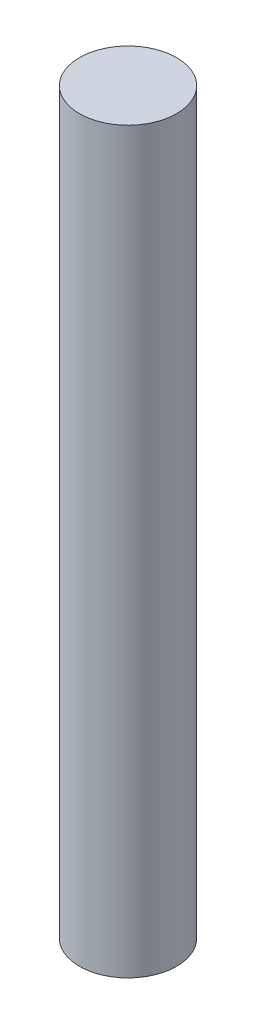
ISO-10303-21;
HEADER;
FILE_DESCRIPTION(('STEP AP214'),'2;1');
FILE_NAME('part.step','',(''),(''),'','','');
FILE_SCHEMA(('AUTOMOTIVE_DESIGN { 1 0 10303 214 1 1 1 1 }'));
ENDSEC;
DATA;
#1=APPLICATION_CONTEXT('core data for automotive mechanical design processes');
#2=APPLICATION_PROTOCOL_DEFINITION('international standard','automotive_design',2000,#1);
#3=PRODUCT_CONTEXT('',#1,'mechanical');
#4=PRODUCT('Part','Part','',(#3));
#5=PRODUCT_RELATED_PRODUCT_CATEGORY('part','',(#4));
#6=PRODUCT_DEFINITION_FORMATION('','',#4);
#7=PRODUCT_DEFINITION_CONTEXT('part definition',#1,'design');
#8=PRODUCT_DEFINITION('design','',#6,#7);
#9=PRODUCT_DEFINITION_SHAPE('','',#8);
#10=(LENGTH_UNIT() NAMED_UNIT(*) SI_UNIT(.MILLI.,.METRE.));
#11=(NAMED_UNIT(*) PLANE_ANGLE_UNIT() SI_UNIT($,.RADIAN.));
#12=(NAMED_UNIT(*) SI_UNIT($,.STERADIAN.) SOLID_ANGLE_UNIT());
#13=UNCERTAINTY_MEASURE_WITH_UNIT(LENGTH_MEASURE(1.E-05),#10,'distance_accuracy_value','');
#14=(GEOMETRIC_REPRESENTATION_CONTEXT(3) GLOBAL_UNCERTAINTY_ASSIGNED_CONTEXT((#13)) GLOBAL_UNIT_ASSIGNED_CONTEXT((#10,
#11,#12)) REPRESENTATION_CONTEXT('',''));
#15=CARTESIAN_POINT('',(0.,0.,0.));
#16=DIRECTION('',(0.,0.,1.));
#17=DIRECTION('',(1.,0.,0.));
#18=AXIS2_PLACEMENT_3D('',#15,#16,#17);
#19=CARTESIAN_POINT('',(0.,96.52,0.));
#20=DIRECTION('',(0.,-1.,0.));
#21=DIRECTION('',(0.,0.,-1.));
#22=AXIS2_PLACEMENT_3D('',#19,#20,#21);
#23=CYLINDRICAL_SURFACE('',#22,6.35);
#24=CARTESIAN_POINT('',(0.,96.52,0.));
#25=DIRECTION('',(0.,1.,0.));
#26=DIRECTION('',(0.,0.,1.));
#27=AXIS2_PLACEMENT_3D('',#24,#25,#26);
#28=CIRCLE('',#27,6.35);
#29=CARTESIAN_POINT('',(0.,96.52,-6.35));
#30=VERTEX_POINT('',#29);
#31=EDGE_CURVE('E10',#30,#30,#28,.T.);
#32=CARTESIAN_POINT('',(0.,0.,0.));
#33=DIRECTION('',(0.,1.,0.));
#34=DIRECTION('',(0.,0.,1.));
#35=AXIS2_PLACEMENT_3D('',#32,#33,#34);
#36=CIRCLE('',#35,6.35);
#37=CARTESIAN_POINT('',(0.,0.,-6.35));
#38=VERTEX_POINT('',#37);
#39=EDGE_CURVE('E34',#38,#38,#36,.T.);
#40=CARTESIAN_POINT('',(0.,96.52,-6.35));
#41=CARTESIAN_POINT('',(0.,95.5145833333333,-6.35));
#42=CARTESIAN_POINT('',(0.,94.5091666666666,-6.35));
#43=CARTESIAN_POINT('',(0.,92.4983333333333,-6.35));
#44=CARTESIAN_POINT('',(0.,91.4929166666666,-6.35));
#45=CARTESIAN_POINT('',(0.,89.4820833333333,-6.35));
#46=CARTESIAN_POINT('',(0.,88.4766666666666,-6.35));
#47=CARTESIAN_POINT('',(0.,86.4658333333333,-6.35));
#48=CARTESIAN_POINT('',(0.,85.4604166666666,-6.35));
#49=CARTESIAN_POINT('',(0.,83.4495833333333,-6.35));
#50=CARTESIAN_POINT('',(0.,82.4441666666666,-6.35));
#51=CARTESIAN_POINT('',(0.,80.4333333333333,-6.35));
#52=CARTESIAN_POINT('',(0.,79.4279166666666,-6.35));
#53=CARTESIAN_POINT('',(0.,77.4170833333333,-6.35));
#54=CARTESIAN_POINT('',(0.,76.4116666666667,-6.35));
#55=CARTESIAN_POINT('',(0.,74.4008333333333,-6.35));
#56=CARTESIAN_POINT('',(0.,73.3954166666667,-6.35));
#57=CARTESIAN_POINT('',(0.,71.3845833333333,-6.35));
#58=CARTESIAN_POINT('',(0.,70.3791666666666,-6.35));
#59=CARTESIAN_POINT('',(0.,68.3683333333333,-6.35));
#60=CARTESIAN_POINT('',(0.,67.3629166666666,-6.35));
#61=CARTESIAN_POINT('',(0.,65.3520833333333,-6.35));
#62=CARTESIAN_POINT('',(0.,64.3466666666666,-6.35));
#63=CARTESIAN_POINT('',(0.,62.3358333333333,-6.35));
#64=CARTESIAN_POINT('',(0.,61.3304166666667,-6.35));
#65=CARTESIAN_POINT('',(0.,59.3195833333333,-6.35));
#66=CARTESIAN_POINT('',(0.,58.3141666666667,-6.35));
#67=CARTESIAN_POINT('',(0.,56.3033333333333,-6.35));
#68=CARTESIAN_POINT('',(0.,55.2979166666667,-6.35));
#69=CARTESIAN_POINT('',(0.,53.2870833333333,-6.35));
#70=CARTESIAN_POINT('',(0.,52.2816666666667,-6.35));
#71=CARTESIAN_POINT('',(0.,50.2708333333333,-6.35));
#72=CARTESIAN_POINT('',(0.,49.2654166666667,-6.35));
#73=CARTESIAN_POINT('',(0.,47.2545833333333,-6.35));
#74=CARTESIAN_POINT('',(0.,46.2491666666667,-6.35));
#75=CARTESIAN_POINT('',(0.,44.2383333333333,-6.35));
#76=CARTESIAN_POINT('',(0.,43.2329166666667,-6.35));
#77=CARTESIAN_POINT('',(0.,41.2220833333333,-6.35));
#78=CARTESIAN_POINT('',(0.,40.2166666666667,-6.35));
#79=CARTESIAN_POINT('',(0.,38.2058333333333,-6.35));
#80=CARTESIAN_POINT('',(0.,37.2004166666667,-6.35));
#81=CARTESIAN_POINT('',(0.,35.1895833333333,-6.35));
#82=CARTESIAN_POINT('',(0.,34.1841666666667,-6.35));
#83=CARTESIAN_POINT('',(0.,32.1733333333333,-6.35));
#84=CARTESIAN_POINT('',(0.,31.1679166666667,-6.35));
#85=CARTESIAN_POINT('',(0.,29.1570833333333,-6.35));
#86=CARTESIAN_POINT('',(0.,28.1516666666667,-6.35));
#87=CARTESIAN_POINT('',(0.,26.1408333333333,-6.35));
#88=CARTESIAN_POINT('',(0.,25.1354166666667,-6.35));
#89=CARTESIAN_POINT('',(0.,23.1245833333333,-6.35));
#90=CARTESIAN_POINT('',(0.,22.1191666666667,-6.35));
#91=CARTESIAN_POINT('',(0.,20.1083333333333,-6.35));
#92=CARTESIAN_POINT('',(0.,19.1029166666667,-6.35));
#93=CARTESIAN_POINT('',(0.,17.0920833333333,-6.35));
#94=CARTESIAN_POINT('',(0.,16.0866666666667,-6.35));
#95=CARTESIAN_POINT('',(0.,14.0758333333333,-6.35));
#96=CARTESIAN_POINT('',(0.,13.0704166666667,-6.35));
#97=CARTESIAN_POINT('',(0.,11.0595833333333,-6.35));
#98=CARTESIAN_POINT('',(0.,10.0541666666667,-6.35));
#99=CARTESIAN_POINT('',(0.,8.04333333333331,-6.35));
#100=CARTESIAN_POINT('',(0.,7.03791666666665,-6.35));
#101=CARTESIAN_POINT('',(0.,5.02708333333332,-6.35));
#102=CARTESIAN_POINT('',(0.,4.02166666666665,-6.35));
#103=CARTESIAN_POINT('',(0.,2.01083333333332,-6.35));
#104=CARTESIAN_POINT('',(0.,1.00541666666665,-6.35));
#105=CARTESIAN_POINT('',(0.,0.,-6.35));
#106=B_SPLINE_CURVE_WITH_KNOTS('',3,(#40,#41,#42,#43,#44,#45,#46,#47,#48,#49,#50,#51,#52,#53,
#54,#55,#56,#57,#58,#59,#60,#61,#62,#63,#64,#65,#66,#67,#68,#69,#70,#71,#72,#73,#74,#75,#76,#77,
#78,#79,#80,#81,#82,#83,#84,#85,#86,#87,#88,#89,#90,#91,#92,#93,#94,#95,#96,#97,#98,#99,#100,
#101,#102,#103,#104,#105),.UNSPECIFIED.,.F.,.F.,(4,2,2,2,2,2,2,2,2,2,2,2,2,2,2,2,2,2,2,2,2,2,2,
2,2,2,2,2,2,2,2,2,4),(0.,3.01625,6.0325,9.04874999999999,12.065,15.08125,18.0975,21.11375,24.13,
27.14625,30.1625,33.17875,36.195,39.21125,42.2275,45.24375,48.26,51.27625,54.2925,57.30875,
60.325,63.34125,66.3575,69.37375,72.39,75.40625,78.4225,81.43875,84.455,87.47125,90.4875,
93.50375,96.52),.UNSPECIFIED.);
#107=EDGE_CURVE('BSEAM31',#30,#38,#106,.T.);
#108=ORIENTED_EDGE('',*,*,#31,.F.);
#109=ORIENTED_EDGE('',*,*,#39,.T.);
#110=ORIENTED_EDGE('',*,*,#107,.T.);
#111=ORIENTED_EDGE('',*,*,#107,.F.);
#112=EDGE_LOOP('',(#108,#110,#109,#111));
#113=FACE_BOUND('',#112,.T.);
#114=ADVANCED_FACE('F31',(#113),#23,.T.);
#115=CARTESIAN_POINT('',(0.,96.52,0.));
#116=DIRECTION('',(0.,1.,0.));
#117=DIRECTION('',(0.,0.,1.));
#118=AXIS2_PLACEMENT_3D('',#115,#116,#117);
#119=PLANE('',#118);
#120=ORIENTED_EDGE('',*,*,#31,.T.);
#121=EDGE_LOOP('',(#120));
#122=FACE_BOUND('',#121,.T.);
#123=ADVANCED_FACE('F46',(#122),#119,.T.);
#124=CARTESIAN_POINT('',(0.,0.,0.));
#125=DIRECTION('',(0.,1.,0.));
#126=DIRECTION('',(0.,0.,1.));
#127=AXIS2_PLACEMENT_3D('',#124,#125,#126);
#128=PLANE('',#127);
#129=ORIENTED_EDGE('',*,*,#39,.F.);
#130=EDGE_LOOP('',(#129));
#131=FACE_BOUND('',#130,.T.);
#132=ADVANCED_FACE('F44',(#131),#128,.F.);
#133=CLOSED_SHELL('',(#114,#123,#132));
#134=MANIFOLD_SOLID_BREP('B2',#133);
#135=ADVANCED_BREP_SHAPE_REPRESENTATION('',(#18,#134),#14);
#136=SHAPE_DEFINITION_REPRESENTATION(#9,#135);
ENDSEC;
END-ISO-10303-21;
